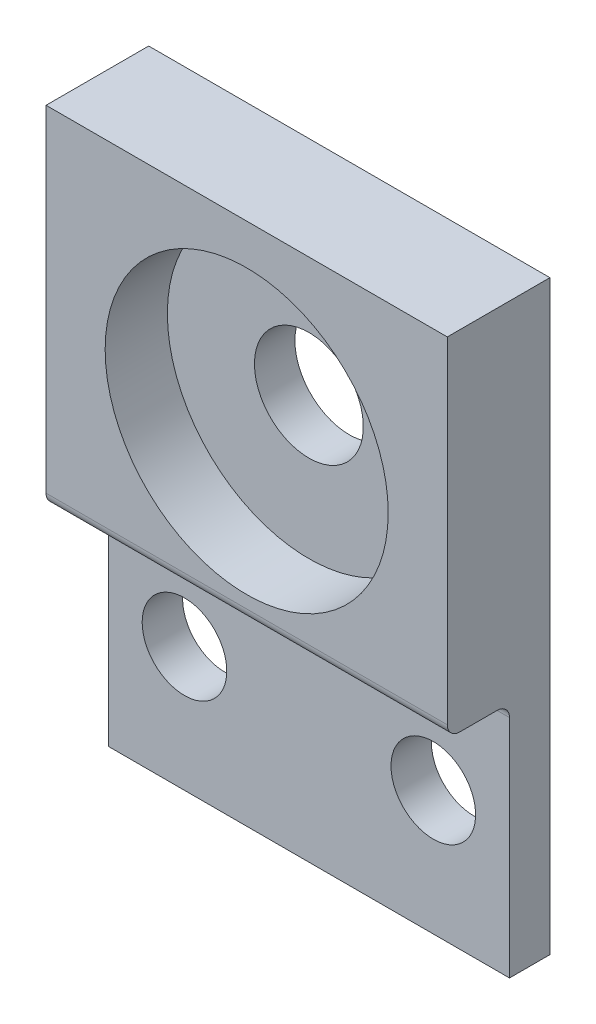
ISO-10303-21;
HEADER;
FILE_DESCRIPTION(('STEP AP214'),'2;1');
FILE_NAME('part.step','',(''),(''),'','','');
FILE_SCHEMA(('AUTOMOTIVE_DESIGN { 1 0 10303 214 1 1 1 1 }'));
ENDSEC;
DATA;
#1=APPLICATION_CONTEXT('core data for automotive mechanical design processes');
#2=APPLICATION_PROTOCOL_DEFINITION('international standard','automotive_design',2000,#1);
#3=PRODUCT_CONTEXT('',#1,'mechanical');
#4=PRODUCT('Part','Part','',(#3));
#5=PRODUCT_RELATED_PRODUCT_CATEGORY('part','',(#4));
#6=PRODUCT_DEFINITION_FORMATION('','',#4);
#7=PRODUCT_DEFINITION_CONTEXT('part definition',#1,'design');
#8=PRODUCT_DEFINITION('design','',#6,#7);
#9=PRODUCT_DEFINITION_SHAPE('','',#8);
#10=(LENGTH_UNIT() NAMED_UNIT(*) SI_UNIT(.MILLI.,.METRE.));
#11=(NAMED_UNIT(*) PLANE_ANGLE_UNIT() SI_UNIT($,.RADIAN.));
#12=(NAMED_UNIT(*) SI_UNIT($,.STERADIAN.) SOLID_ANGLE_UNIT());
#13=UNCERTAINTY_MEASURE_WITH_UNIT(LENGTH_MEASURE(1.E-05),#10,'distance_accuracy_value','');
#14=(GEOMETRIC_REPRESENTATION_CONTEXT(3) GLOBAL_UNCERTAINTY_ASSIGNED_CONTEXT((#13)) GLOBAL_UNIT_ASSIGNED_CONTEXT((#10,
#11,#12)) REPRESENTATION_CONTEXT('',''));
#15=CARTESIAN_POINT('',(0.,0.,0.));
#16=DIRECTION('',(0.,0.,1.));
#17=DIRECTION('',(1.,0.,0.));
#18=AXIS2_PLACEMENT_3D('',#15,#16,#17);
#19=CARTESIAN_POINT('',(0.,0.,3.25));
#20=DIRECTION('',(0.,0.,1.));
#21=DIRECTION('',(1.,0.,0.));
#22=AXIS2_PLACEMENT_3D('',#19,#20,#21);
#23=PLANE('',#22);
#24=CARTESIAN_POINT('',(26.125,10.,3.25));
#25=DIRECTION('',(0.,0.,1.));
#26=DIRECTION('',(1.,0.,0.));
#27=AXIS2_PLACEMENT_3D('',#24,#25,#26);
#28=CIRCLE('',#27,3.40036762718386);
#29=CARTESIAN_POINT('',(22.7246323728161,10.,3.25));
#30=VERTEX_POINT('',#29);
#31=EDGE_CURVE('E141',#30,#30,#28,.T.);
#32=ORIENTED_EDGE('',*,*,#31,.F.);
#33=EDGE_LOOP('',(#32));
#34=FACE_BOUND('',#33,.T.);
#35=CARTESIAN_POINT('',(6.125,10.,3.25));
#36=DIRECTION('',(0.,0.,1.));
#37=DIRECTION('',(1.,0.,0.));
#38=AXIS2_PLACEMENT_3D('',#35,#36,#37);
#39=CIRCLE('',#38,3.40036762718386);
#40=CARTESIAN_POINT('',(2.72463237281614,10.,3.25));
#41=VERTEX_POINT('',#40);
#42=EDGE_CURVE('E144',#41,#41,#39,.T.);
#43=ORIENTED_EDGE('',*,*,#42,.F.);
#44=EDGE_LOOP('',(#43));
#45=FACE_BOUND('',#44,.T.);
#46=DIRECTION('',(0.,1.,0.));
#47=VECTOR('',#46,1.);
#48=CARTESIAN_POINT('',(32.25,0.,3.25));
#49=LINE('',#48,#47);
#50=CARTESIAN_POINT('',(32.25,0.,3.25));
#51=VERTEX_POINT('',#50);
#52=CARTESIAN_POINT('',(32.25,18.125,3.25));
#53=VERTEX_POINT('',#52);
#54=EDGE_CURVE('E151',#51,#53,#49,.T.);
#55=ORIENTED_EDGE('',*,*,#54,.T.);
#56=DIRECTION('',(-1.,0.,0.));
#57=VECTOR('',#56,1.);
#58=CARTESIAN_POINT('',(0.,18.125,3.25));
#59=LINE('',#58,#57);
#60=CARTESIAN_POINT('',(0.,18.125,3.25));
#61=VERTEX_POINT('',#60);
#62=EDGE_CURVE('E187',#53,#61,#59,.T.);
#63=ORIENTED_EDGE('',*,*,#62,.T.);
#64=DIRECTION('',(0.,1.,0.));
#65=VECTOR('',#64,1.);
#66=CARTESIAN_POINT('',(0.,0.,3.25));
#67=LINE('',#66,#65);
#68=CARTESIAN_POINT('',(0.,0.,3.25));
#69=VERTEX_POINT('',#68);
#70=EDGE_CURVE('E154',#69,#61,#67,.T.);
#71=ORIENTED_EDGE('',*,*,#70,.F.);
#72=DIRECTION('',(1.,0.,0.));
#73=VECTOR('',#72,1.);
#74=CARTESIAN_POINT('',(0.,0.,3.25));
#75=LINE('',#74,#73);
#76=EDGE_CURVE('E148',#69,#51,#75,.T.);
#77=ORIENTED_EDGE('',*,*,#76,.T.);
#78=EDGE_LOOP('',(#55,#63,#71,#77));
#79=FACE_BOUND('',#78,.T.);
#80=ADVANCED_FACE('F37',(#34,#45,#79),#23,.T.);
#81=CARTESIAN_POINT('',(0.,0.,3.25));
#82=DIRECTION('',(0.,1.,0.));
#83=DIRECTION('',(-1.,0.,0.));
#84=AXIS2_PLACEMENT_3D('',#81,#82,#83);
#85=PLANE('',#84);
#86=DIRECTION('',(1.,0.,0.));
#87=VECTOR('',#86,1.);
#88=CARTESIAN_POINT('',(0.,0.,0.));
#89=LINE('',#88,#87);
#90=CARTESIAN_POINT('',(0.,0.,0.));
#91=VERTEX_POINT('',#90);
#92=CARTESIAN_POINT('',(32.25,0.,0.));
#93=VERTEX_POINT('',#92);
#94=EDGE_CURVE('E165',#91,#93,#89,.T.);
#95=ORIENTED_EDGE('',*,*,#94,.T.);
#96=DIRECTION('',(0.,0.,-1.));
#97=VECTOR('',#96,1.);
#98=CARTESIAN_POINT('',(32.25,0.,3.25));
#99=LINE('',#98,#97);
#100=EDGE_CURVE('E121',#51,#93,#99,.T.);
#101=ORIENTED_EDGE('',*,*,#100,.F.);
#102=ORIENTED_EDGE('',*,*,#76,.F.);
#103=DIRECTION('',(0.,0.,-1.));
#104=VECTOR('',#103,1.);
#105=CARTESIAN_POINT('',(0.,0.,3.25));
#106=LINE('',#105,#104);
#107=EDGE_CURVE('E159',#69,#91,#106,.T.);
#108=ORIENTED_EDGE('',*,*,#107,.T.);
#109=EDGE_LOOP('',(#95,#101,#102,#108));
#110=FACE_BOUND('',#109,.T.);
#111=ADVANCED_FACE('F197',(#110),#85,.F.);
#112=CARTESIAN_POINT('',(32.25,0.,3.25));
#113=DIRECTION('',(-1.,0.,0.));
#114=DIRECTION('',(0.,-1.,0.));
#115=AXIS2_PLACEMENT_3D('',#112,#113,#114);
#116=PLANE('',#115);
#117=DIRECTION('',(0.,1.,0.));
#118=VECTOR('',#117,1.);
#119=CARTESIAN_POINT('',(32.25,0.,8.25));
#120=LINE('',#119,#118);
#121=CARTESIAN_POINT('',(32.25,20.125,8.25));
#122=VERTEX_POINT('',#121);
#123=CARTESIAN_POINT('',(32.25,47.125,8.25));
#124=VERTEX_POINT('',#123);
#125=EDGE_CURVE('E102',#122,#124,#120,.T.);
#126=ORIENTED_EDGE('',*,*,#125,.F.);
#127=CARTESIAN_POINT('',(32.25,20.125,7.25));
#128=DIRECTION('',(-1.,0.,0.));
#129=DIRECTION('',(0.,-1.,0.));
#130=AXIS2_PLACEMENT_3D('',#127,#128,#129);
#131=CIRCLE('',#130,1.);
#132=CARTESIAN_POINT('',(32.25,19.125,7.25));
#133=VERTEX_POINT('',#132);
#134=EDGE_CURVE('E179',#122,#133,#131,.F.);
#135=ORIENTED_EDGE('',*,*,#134,.T.);
#136=DIRECTION('',(0.,0.,-1.));
#137=VECTOR('',#136,1.);
#138=CARTESIAN_POINT('',(32.25,19.125,8.25));
#139=LINE('',#138,#137);
#140=CARTESIAN_POINT('',(32.25,19.125,4.25));
#141=VERTEX_POINT('',#140);
#142=EDGE_CURVE('E134',#133,#141,#139,.T.);
#143=ORIENTED_EDGE('',*,*,#142,.T.);
#144=CARTESIAN_POINT('',(32.25,18.125,4.25));
#145=DIRECTION('',(-1.,0.,0.));
#146=DIRECTION('',(0.,-1.,0.));
#147=AXIS2_PLACEMENT_3D('',#144,#145,#146);
#148=CIRCLE('',#147,1.);
#149=EDGE_CURVE('E11',#141,#53,#148,.T.);
#150=ORIENTED_EDGE('',*,*,#149,.T.);
#151=ORIENTED_EDGE('',*,*,#54,.F.);
#152=ORIENTED_EDGE('',*,*,#100,.T.);
#153=DIRECTION('',(0.,1.,0.));
#154=VECTOR('',#153,1.);
#155=CARTESIAN_POINT('',(32.25,0.,0.));
#156=LINE('',#155,#154);
#157=CARTESIAN_POINT('',(32.25,47.125,0.));
#158=VERTEX_POINT('',#157);
#159=EDGE_CURVE('E117',#93,#158,#156,.T.);
#160=ORIENTED_EDGE('',*,*,#159,.T.);
#161=DIRECTION('',(0.,0.,-1.));
#162=VECTOR('',#161,1.);
#163=CARTESIAN_POINT('',(32.25,47.125,3.25));
#164=LINE('',#163,#162);
#165=EDGE_CURVE('E114',#124,#158,#164,.T.);
#166=ORIENTED_EDGE('',*,*,#165,.F.);
#167=EDGE_LOOP('',(#126,#135,#143,#150,#151,#152,#160,#166));
#168=FACE_BOUND('',#167,.T.);
#169=ADVANCED_FACE('F115',(#168),#116,.F.);
#170=CARTESIAN_POINT('',(0.,47.125,3.25));
#171=DIRECTION('',(0.,1.,0.));
#172=DIRECTION('',(0.,0.,1.));
#173=AXIS2_PLACEMENT_3D('',#170,#171,#172);
#174=PLANE('',#173);
#175=DIRECTION('',(1.,0.,0.));
#176=VECTOR('',#175,1.);
#177=CARTESIAN_POINT('',(0.,47.125,0.));
#178=LINE('',#177,#176);
#179=CARTESIAN_POINT('',(0.,47.125,0.));
#180=VERTEX_POINT('',#179);
#181=EDGE_CURVE('E169',#180,#158,#178,.T.);
#182=ORIENTED_EDGE('',*,*,#181,.F.);
#183=DIRECTION('',(0.,0.,-1.));
#184=VECTOR('',#183,1.);
#185=CARTESIAN_POINT('',(0.,47.125,3.25));
#186=LINE('',#185,#184);
#187=CARTESIAN_POINT('',(0.,47.125,8.25));
#188=VERTEX_POINT('',#187);
#189=EDGE_CURVE('E122',#188,#180,#186,.T.);
#190=ORIENTED_EDGE('',*,*,#189,.F.);
#191=DIRECTION('',(1.,0.,0.));
#192=VECTOR('',#191,1.);
#193=CARTESIAN_POINT('',(0.,47.125,8.25));
#194=LINE('',#193,#192);
#195=EDGE_CURVE('E107',#188,#124,#194,.T.);
#196=ORIENTED_EDGE('',*,*,#195,.T.);
#197=ORIENTED_EDGE('',*,*,#165,.T.);
#198=EDGE_LOOP('',(#182,#190,#196,#197));
#199=FACE_BOUND('',#198,.T.);
#200=ADVANCED_FACE('F125',(#199),#174,.T.);
#201=CARTESIAN_POINT('',(0.,0.,3.25));
#202=DIRECTION('',(-1.,0.,0.));
#203=DIRECTION('',(0.,0.,1.));
#204=AXIS2_PLACEMENT_3D('',#201,#202,#203);
#205=PLANE('',#204);
#206=DIRECTION('',(0.,0.,-1.));
#207=VECTOR('',#206,1.);
#208=CARTESIAN_POINT('',(0.,19.125,8.25));
#209=LINE('',#208,#207);
#210=CARTESIAN_POINT('',(0.,19.125,7.25));
#211=VERTEX_POINT('',#210);
#212=CARTESIAN_POINT('',(0.,19.125,4.25));
#213=VERTEX_POINT('',#212);
#214=EDGE_CURVE('E129',#211,#213,#209,.T.);
#215=ORIENTED_EDGE('',*,*,#214,.F.);
#216=CARTESIAN_POINT('',(0.,20.125,7.25));
#217=DIRECTION('',(-1.,0.,0.));
#218=DIRECTION('',(0.,0.,1.));
#219=AXIS2_PLACEMENT_3D('',#216,#217,#218);
#220=CIRCLE('',#219,1.);
#221=CARTESIAN_POINT('',(0.,20.125,8.25));
#222=VERTEX_POINT('',#221);
#223=EDGE_CURVE('E185',#211,#222,#220,.T.);
#224=ORIENTED_EDGE('',*,*,#223,.T.);
#225=DIRECTION('',(0.,1.,0.));
#226=VECTOR('',#225,1.);
#227=CARTESIAN_POINT('',(0.,0.,8.25));
#228=LINE('',#227,#226);
#229=EDGE_CURVE('E127',#222,#188,#228,.T.);
#230=ORIENTED_EDGE('',*,*,#229,.T.);
#231=ORIENTED_EDGE('',*,*,#189,.T.);
#232=DIRECTION('',(0.,1.,0.));
#233=VECTOR('',#232,1.);
#234=CARTESIAN_POINT('',(0.,0.,0.));
#235=LINE('',#234,#233);
#236=EDGE_CURVE('E171',#91,#180,#235,.T.);
#237=ORIENTED_EDGE('',*,*,#236,.F.);
#238=ORIENTED_EDGE('',*,*,#107,.F.);
#239=ORIENTED_EDGE('',*,*,#70,.T.);
#240=CARTESIAN_POINT('',(0.,18.125,4.25));
#241=DIRECTION('',(-1.,0.,0.));
#242=DIRECTION('',(0.,0.,1.));
#243=AXIS2_PLACEMENT_3D('',#240,#241,#242);
#244=CIRCLE('',#243,1.);
#245=EDGE_CURVE('E45',#61,#213,#244,.F.);
#246=ORIENTED_EDGE('',*,*,#245,.T.);
#247=EDGE_LOOP('',(#215,#224,#230,#231,#237,#238,#239,#246));
#248=FACE_BOUND('',#247,.T.);
#249=ADVANCED_FACE('F191',(#248),#205,.T.);
#250=CARTESIAN_POINT('',(6.125,10.,3.25));
#251=DIRECTION('',(0.,0.,-1.));
#252=DIRECTION('',(-1.,0.,0.));
#253=AXIS2_PLACEMENT_3D('',#250,#251,#252);
#254=CYLINDRICAL_SURFACE('',#253,3.40036762718386);
#255=CARTESIAN_POINT('',(6.125,10.,0.));
#256=DIRECTION('',(0.,0.,1.));
#257=DIRECTION('',(1.,0.,0.));
#258=AXIS2_PLACEMENT_3D('',#255,#256,#257);
#259=CIRCLE('',#258,3.40036762718386);
#260=CARTESIAN_POINT('',(2.72463237281614,10.,0.));
#261=VERTEX_POINT('',#260);
#262=EDGE_CURVE('E162',#261,#261,#259,.T.);
#263=CARTESIAN_POINT('',(2.72463237281614,10.,3.25));
#264=CARTESIAN_POINT('',(2.72463237281614,10.,3.21614583333333));
#265=CARTESIAN_POINT('',(2.72463237281614,10.,3.18229166666667));
#266=CARTESIAN_POINT('',(2.72463237281614,10.,3.11458333333333));
#267=CARTESIAN_POINT('',(2.72463237281614,10.,3.08072916666667));
#268=CARTESIAN_POINT('',(2.72463237281614,10.,3.01302083333333));
#269=CARTESIAN_POINT('',(2.72463237281614,10.,2.97916666666667));
#270=CARTESIAN_POINT('',(2.72463237281614,10.,2.91145833333333));
#271=CARTESIAN_POINT('',(2.72463237281614,10.,2.87760416666667));
#272=CARTESIAN_POINT('',(2.72463237281614,10.,2.80989583333333));
#273=CARTESIAN_POINT('',(2.72463237281614,10.,2.77604166666667));
#274=CARTESIAN_POINT('',(2.72463237281614,10.,2.70833333333333));
#275=CARTESIAN_POINT('',(2.72463237281614,10.,2.67447916666667));
#276=CARTESIAN_POINT('',(2.72463237281614,10.,2.60677083333333));
#277=CARTESIAN_POINT('',(2.72463237281614,10.,2.57291666666667));
#278=CARTESIAN_POINT('',(2.72463237281614,10.,2.50520833333333));
#279=CARTESIAN_POINT('',(2.72463237281614,10.,2.47135416666667));
#280=CARTESIAN_POINT('',(2.72463237281614,10.,2.40364583333333));
#281=CARTESIAN_POINT('',(2.72463237281614,10.,2.36979166666667));
#282=CARTESIAN_POINT('',(2.72463237281614,10.,2.30208333333333));
#283=CARTESIAN_POINT('',(2.72463237281614,10.,2.26822916666667));
#284=CARTESIAN_POINT('',(2.72463237281614,10.,2.20052083333333));
#285=CARTESIAN_POINT('',(2.72463237281614,10.,2.16666666666667));
#286=CARTESIAN_POINT('',(2.72463237281614,10.,2.09895833333333));
#287=CARTESIAN_POINT('',(2.72463237281614,10.,2.06510416666667));
#288=CARTESIAN_POINT('',(2.72463237281614,10.,1.99739583333333));
#289=CARTESIAN_POINT('',(2.72463237281614,10.,1.96354166666667));
#290=CARTESIAN_POINT('',(2.72463237281614,10.,1.89583333333333));
#291=CARTESIAN_POINT('',(2.72463237281614,10.,1.86197916666667));
#292=CARTESIAN_POINT('',(2.72463237281614,10.,1.79427083333333));
#293=CARTESIAN_POINT('',(2.72463237281614,10.,1.76041666666667));
#294=CARTESIAN_POINT('',(2.72463237281614,10.,1.69270833333333));
#295=CARTESIAN_POINT('',(2.72463237281614,10.,1.65885416666667));
#296=CARTESIAN_POINT('',(2.72463237281614,10.,1.59114583333333));
#297=CARTESIAN_POINT('',(2.72463237281614,10.,1.55729166666667));
#298=CARTESIAN_POINT('',(2.72463237281614,10.,1.48958333333333));
#299=CARTESIAN_POINT('',(2.72463237281614,10.,1.45572916666667));
#300=CARTESIAN_POINT('',(2.72463237281614,10.,1.38802083333333));
#301=CARTESIAN_POINT('',(2.72463237281614,10.,1.35416666666667));
#302=CARTESIAN_POINT('',(2.72463237281614,10.,1.28645833333333));
#303=CARTESIAN_POINT('',(2.72463237281614,10.,1.25260416666667));
#304=CARTESIAN_POINT('',(2.72463237281614,10.,1.18489583333333));
#305=CARTESIAN_POINT('',(2.72463237281614,10.,1.15104166666667));
#306=CARTESIAN_POINT('',(2.72463237281614,10.,1.08333333333333));
#307=CARTESIAN_POINT('',(2.72463237281614,10.,1.04947916666667));
#308=CARTESIAN_POINT('',(2.72463237281614,10.,0.981770833333333));
#309=CARTESIAN_POINT('',(2.72463237281614,10.,0.947916666666667));
#310=CARTESIAN_POINT('',(2.72463237281614,10.,0.880208333333333));
#311=CARTESIAN_POINT('',(2.72463237281614,10.,0.846354166666667));
#312=CARTESIAN_POINT('',(2.72463237281614,10.,0.778645833333333));
#313=CARTESIAN_POINT('',(2.72463237281614,10.,0.744791666666667));
#314=CARTESIAN_POINT('',(2.72463237281614,10.,0.677083333333333));
#315=CARTESIAN_POINT('',(2.72463237281614,10.,0.643229166666667));
#316=CARTESIAN_POINT('',(2.72463237281614,10.,0.575520833333333));
#317=CARTESIAN_POINT('',(2.72463237281614,10.,0.541666666666667));
#318=CARTESIAN_POINT('',(2.72463237281614,10.,0.473958333333333));
#319=CARTESIAN_POINT('',(2.72463237281614,10.,0.440104166666667));
#320=CARTESIAN_POINT('',(2.72463237281614,10.,0.372395833333333));
#321=CARTESIAN_POINT('',(2.72463237281614,10.,0.338541666666667));
#322=CARTESIAN_POINT('',(2.72463237281614,10.,0.270833333333333));
#323=CARTESIAN_POINT('',(2.72463237281614,10.,0.236979166666667));
#324=CARTESIAN_POINT('',(2.72463237281614,10.,0.169270833333333));
#325=CARTESIAN_POINT('',(2.72463237281614,10.,0.135416666666667));
#326=CARTESIAN_POINT('',(2.72463237281614,10.,0.0677083333333334));
#327=CARTESIAN_POINT('',(2.72463237281614,10.,0.0338541666666667));
#328=CARTESIAN_POINT('',(2.72463237281614,10.,0.));
#329=B_SPLINE_CURVE_WITH_KNOTS('',3,(#263,#264,#265,#266,#267,#268,#269,#270,#271,#272,#273,
#274,#275,#276,#277,#278,#279,#280,#281,#282,#283,#284,#285,#286,#287,#288,#289,#290,#291,#292,
#293,#294,#295,#296,#297,#298,#299,#300,#301,#302,#303,#304,#305,#306,#307,#308,#309,#310,#311,
#312,#313,#314,#315,#316,#317,#318,#319,#320,#321,#322,#323,#324,#325,#326,#327,#328),
.UNSPECIFIED.,.F.,.F.,(4,2,2,2,2,2,2,2,2,2,2,2,2,2,2,2,2,2,2,2,2,2,2,2,2,2,2,2,2,2,2,2,4),(0.,
0.1015625,0.203125,0.3046875,0.40625,0.5078125,0.609375,0.7109375,0.8125,0.9140625,1.015625,
1.1171875,1.21875,1.3203125,1.421875,1.5234375,1.625,1.7265625,1.828125,1.9296875,2.03125,
2.1328125,2.234375,2.3359375,2.4375,2.5390625,2.640625,2.7421875,2.84375,2.9453125,3.046875,
3.1484375,3.25),.UNSPECIFIED.);
#330=EDGE_CURVE('BSEAM249',#41,#261,#329,.T.);
#331=ORIENTED_EDGE('',*,*,#42,.T.);
#332=ORIENTED_EDGE('',*,*,#262,.F.);
#333=ORIENTED_EDGE('',*,*,#330,.T.);
#334=ORIENTED_EDGE('',*,*,#330,.F.);
#335=EDGE_LOOP('',(#331,#333,#332,#334));
#336=FACE_BOUND('',#335,.T.);
#337=ADVANCED_FACE('F249',(#336),#254,.F.);
#338=CARTESIAN_POINT('',(26.125,10.,3.25));
#339=DIRECTION('',(0.,0.,-1.));
#340=DIRECTION('',(-1.,0.,0.));
#341=AXIS2_PLACEMENT_3D('',#338,#339,#340);
#342=CYLINDRICAL_SURFACE('',#341,3.40036762718386);
#343=CARTESIAN_POINT('',(26.125,10.,0.));
#344=DIRECTION('',(0.,0.,1.));
#345=DIRECTION('',(1.,0.,0.));
#346=AXIS2_PLACEMENT_3D('',#343,#344,#345);
#347=CIRCLE('',#346,3.40036762718386);
#348=CARTESIAN_POINT('',(22.7246323728161,10.,0.));
#349=VERTEX_POINT('',#348);
#350=EDGE_CURVE('E137',#349,#349,#347,.T.);
#351=CARTESIAN_POINT('',(22.7246323728161,10.,3.25));
#352=CARTESIAN_POINT('',(22.7246323728161,10.,3.21614583333333));
#353=CARTESIAN_POINT('',(22.7246323728161,10.,3.18229166666667));
#354=CARTESIAN_POINT('',(22.7246323728161,10.,3.11458333333333));
#355=CARTESIAN_POINT('',(22.7246323728161,10.,3.08072916666667));
#356=CARTESIAN_POINT('',(22.7246323728161,10.,3.01302083333333));
#357=CARTESIAN_POINT('',(22.7246323728161,10.,2.97916666666667));
#358=CARTESIAN_POINT('',(22.7246323728161,10.,2.91145833333333));
#359=CARTESIAN_POINT('',(22.7246323728161,10.,2.87760416666667));
#360=CARTESIAN_POINT('',(22.7246323728161,10.,2.80989583333333));
#361=CARTESIAN_POINT('',(22.7246323728161,10.,2.77604166666667));
#362=CARTESIAN_POINT('',(22.7246323728161,10.,2.70833333333333));
#363=CARTESIAN_POINT('',(22.7246323728161,10.,2.67447916666667));
#364=CARTESIAN_POINT('',(22.7246323728161,10.,2.60677083333333));
#365=CARTESIAN_POINT('',(22.7246323728161,10.,2.57291666666667));
#366=CARTESIAN_POINT('',(22.7246323728161,10.,2.50520833333333));
#367=CARTESIAN_POINT('',(22.7246323728161,10.,2.47135416666667));
#368=CARTESIAN_POINT('',(22.7246323728161,10.,2.40364583333333));
#369=CARTESIAN_POINT('',(22.7246323728161,10.,2.36979166666667));
#370=CARTESIAN_POINT('',(22.7246323728161,10.,2.30208333333333));
#371=CARTESIAN_POINT('',(22.7246323728161,10.,2.26822916666667));
#372=CARTESIAN_POINT('',(22.7246323728161,10.,2.20052083333333));
#373=CARTESIAN_POINT('',(22.7246323728161,10.,2.16666666666667));
#374=CARTESIAN_POINT('',(22.7246323728161,10.,2.09895833333333));
#375=CARTESIAN_POINT('',(22.7246323728161,10.,2.06510416666667));
#376=CARTESIAN_POINT('',(22.7246323728161,10.,1.99739583333333));
#377=CARTESIAN_POINT('',(22.7246323728161,10.,1.96354166666667));
#378=CARTESIAN_POINT('',(22.7246323728161,10.,1.89583333333333));
#379=CARTESIAN_POINT('',(22.7246323728161,10.,1.86197916666667));
#380=CARTESIAN_POINT('',(22.7246323728161,10.,1.79427083333333));
#381=CARTESIAN_POINT('',(22.7246323728161,10.,1.76041666666667));
#382=CARTESIAN_POINT('',(22.7246323728161,10.,1.69270833333333));
#383=CARTESIAN_POINT('',(22.7246323728161,10.,1.65885416666667));
#384=CARTESIAN_POINT('',(22.7246323728161,10.,1.59114583333333));
#385=CARTESIAN_POINT('',(22.7246323728161,10.,1.55729166666667));
#386=CARTESIAN_POINT('',(22.7246323728161,10.,1.48958333333333));
#387=CARTESIAN_POINT('',(22.7246323728161,10.,1.45572916666667));
#388=CARTESIAN_POINT('',(22.7246323728161,10.,1.38802083333333));
#389=CARTESIAN_POINT('',(22.7246323728161,10.,1.35416666666667));
#390=CARTESIAN_POINT('',(22.7246323728161,10.,1.28645833333333));
#391=CARTESIAN_POINT('',(22.7246323728161,10.,1.25260416666667));
#392=CARTESIAN_POINT('',(22.7246323728161,10.,1.18489583333333));
#393=CARTESIAN_POINT('',(22.7246323728161,10.,1.15104166666667));
#394=CARTESIAN_POINT('',(22.7246323728161,10.,1.08333333333333));
#395=CARTESIAN_POINT('',(22.7246323728161,10.,1.04947916666667));
#396=CARTESIAN_POINT('',(22.7246323728161,10.,0.981770833333333));
#397=CARTESIAN_POINT('',(22.7246323728161,10.,0.947916666666667));
#398=CARTESIAN_POINT('',(22.7246323728161,10.,0.880208333333333));
#399=CARTESIAN_POINT('',(22.7246323728161,10.,0.846354166666667));
#400=CARTESIAN_POINT('',(22.7246323728161,10.,0.778645833333333));
#401=CARTESIAN_POINT('',(22.7246323728161,10.,0.744791666666667));
#402=CARTESIAN_POINT('',(22.7246323728161,10.,0.677083333333333));
#403=CARTESIAN_POINT('',(22.7246323728161,10.,0.643229166666667));
#404=CARTESIAN_POINT('',(22.7246323728161,10.,0.575520833333333));
#405=CARTESIAN_POINT('',(22.7246323728161,10.,0.541666666666667));
#406=CARTESIAN_POINT('',(22.7246323728161,10.,0.473958333333333));
#407=CARTESIAN_POINT('',(22.7246323728161,10.,0.440104166666667));
#408=CARTESIAN_POINT('',(22.7246323728161,10.,0.372395833333333));
#409=CARTESIAN_POINT('',(22.7246323728161,10.,0.338541666666667));
#410=CARTESIAN_POINT('',(22.7246323728161,10.,0.270833333333333));
#411=CARTESIAN_POINT('',(22.7246323728161,10.,0.236979166666667));
#412=CARTESIAN_POINT('',(22.7246323728161,10.,0.169270833333333));
#413=CARTESIAN_POINT('',(22.7246323728161,10.,0.135416666666667));
#414=CARTESIAN_POINT('',(22.7246323728161,10.,0.0677083333333334));
#415=CARTESIAN_POINT('',(22.7246323728161,10.,0.0338541666666667));
#416=CARTESIAN_POINT('',(22.7246323728161,10.,0.));
#417=B_SPLINE_CURVE_WITH_KNOTS('',3,(#351,#352,#353,#354,#355,#356,#357,#358,#359,#360,#361,
#362,#363,#364,#365,#366,#367,#368,#369,#370,#371,#372,#373,#374,#375,#376,#377,#378,#379,#380,
#381,#382,#383,#384,#385,#386,#387,#388,#389,#390,#391,#392,#393,#394,#395,#396,#397,#398,#399,
#400,#401,#402,#403,#404,#405,#406,#407,#408,#409,#410,#411,#412,#413,#414,#415,#416),
.UNSPECIFIED.,.F.,.F.,(4,2,2,2,2,2,2,2,2,2,2,2,2,2,2,2,2,2,2,2,2,2,2,2,2,2,2,2,2,2,2,2,4),(0.,
0.1015625,0.203125,0.3046875,0.40625,0.5078125,0.609375,0.7109375,0.8125,0.9140625,1.015625,
1.1171875,1.21875,1.3203125,1.421875,1.5234375,1.625,1.7265625,1.828125,1.9296875,2.03125,
2.1328125,2.234375,2.3359375,2.4375,2.5390625,2.640625,2.7421875,2.84375,2.9453125,3.046875,
3.1484375,3.25),.UNSPECIFIED.);
#418=EDGE_CURVE('BSEAM235',#30,#349,#417,.T.);
#419=ORIENTED_EDGE('',*,*,#31,.T.);
#420=ORIENTED_EDGE('',*,*,#350,.F.);
#421=ORIENTED_EDGE('',*,*,#418,.T.);
#422=ORIENTED_EDGE('',*,*,#418,.F.);
#423=EDGE_LOOP('',(#419,#421,#420,#422));
#424=FACE_BOUND('',#423,.T.);
#425=ADVANCED_FACE('F235',(#424),#342,.F.);
#426=CARTESIAN_POINT('',(16.125,32.5,3.25));
#427=DIRECTION('',(0.,0.,-1.));
#428=DIRECTION('',(-1.,0.,0.));
#429=AXIS2_PLACEMENT_3D('',#426,#427,#428);
#430=CYLINDRICAL_SURFACE('',#429,4.375);
#431=CARTESIAN_POINT('',(16.125,32.5,3.25));
#432=DIRECTION('',(0.,0.,1.));
#433=DIRECTION('',(1.,0.,0.));
#434=AXIS2_PLACEMENT_3D('',#431,#432,#433);
#435=CIRCLE('',#434,4.375);
#436=CARTESIAN_POINT('',(11.75,32.5,3.25));
#437=VERTEX_POINT('',#436);
#438=EDGE_CURVE('E156',#437,#437,#435,.T.);
#439=CARTESIAN_POINT('',(16.125,32.5,0.));
#440=DIRECTION('',(0.,0.,1.));
#441=DIRECTION('',(1.,0.,0.));
#442=AXIS2_PLACEMENT_3D('',#439,#440,#441);
#443=CIRCLE('',#442,4.375);
#444=CARTESIAN_POINT('',(11.75,32.5,0.));
#445=VERTEX_POINT('',#444);
#446=EDGE_CURVE('E145',#445,#445,#443,.T.);
#447=CARTESIAN_POINT('',(11.75,32.5,3.25));
#448=CARTESIAN_POINT('',(11.75,32.5,3.21614583333333));
#449=CARTESIAN_POINT('',(11.75,32.5,3.18229166666667));
#450=CARTESIAN_POINT('',(11.75,32.5,3.11458333333333));
#451=CARTESIAN_POINT('',(11.75,32.5,3.08072916666667));
#452=CARTESIAN_POINT('',(11.75,32.5,3.01302083333333));
#453=CARTESIAN_POINT('',(11.75,32.5,2.97916666666667));
#454=CARTESIAN_POINT('',(11.75,32.5,2.91145833333333));
#455=CARTESIAN_POINT('',(11.75,32.5,2.87760416666667));
#456=CARTESIAN_POINT('',(11.75,32.5,2.80989583333333));
#457=CARTESIAN_POINT('',(11.75,32.5,2.77604166666667));
#458=CARTESIAN_POINT('',(11.75,32.5,2.70833333333333));
#459=CARTESIAN_POINT('',(11.75,32.5,2.67447916666667));
#460=CARTESIAN_POINT('',(11.75,32.5,2.60677083333333));
#461=CARTESIAN_POINT('',(11.75,32.5,2.57291666666667));
#462=CARTESIAN_POINT('',(11.75,32.5,2.50520833333333));
#463=CARTESIAN_POINT('',(11.75,32.5,2.47135416666667));
#464=CARTESIAN_POINT('',(11.75,32.5,2.40364583333333));
#465=CARTESIAN_POINT('',(11.75,32.5,2.36979166666667));
#466=CARTESIAN_POINT('',(11.75,32.5,2.30208333333333));
#467=CARTESIAN_POINT('',(11.75,32.5,2.26822916666667));
#468=CARTESIAN_POINT('',(11.75,32.5,2.20052083333333));
#469=CARTESIAN_POINT('',(11.75,32.5,2.16666666666667));
#470=CARTESIAN_POINT('',(11.75,32.5,2.09895833333333));
#471=CARTESIAN_POINT('',(11.75,32.5,2.06510416666667));
#472=CARTESIAN_POINT('',(11.75,32.5,1.99739583333333));
#473=CARTESIAN_POINT('',(11.75,32.5,1.96354166666667));
#474=CARTESIAN_POINT('',(11.75,32.5,1.89583333333333));
#475=CARTESIAN_POINT('',(11.75,32.5,1.86197916666667));
#476=CARTESIAN_POINT('',(11.75,32.5,1.79427083333333));
#477=CARTESIAN_POINT('',(11.75,32.5,1.76041666666667));
#478=CARTESIAN_POINT('',(11.75,32.5,1.69270833333333));
#479=CARTESIAN_POINT('',(11.75,32.5,1.65885416666667));
#480=CARTESIAN_POINT('',(11.75,32.5,1.59114583333333));
#481=CARTESIAN_POINT('',(11.75,32.5,1.55729166666667));
#482=CARTESIAN_POINT('',(11.75,32.5,1.48958333333333));
#483=CARTESIAN_POINT('',(11.75,32.5,1.45572916666667));
#484=CARTESIAN_POINT('',(11.75,32.5,1.38802083333333));
#485=CARTESIAN_POINT('',(11.75,32.5,1.35416666666667));
#486=CARTESIAN_POINT('',(11.75,32.5,1.28645833333333));
#487=CARTESIAN_POINT('',(11.75,32.5,1.25260416666667));
#488=CARTESIAN_POINT('',(11.75,32.5,1.18489583333333));
#489=CARTESIAN_POINT('',(11.75,32.5,1.15104166666667));
#490=CARTESIAN_POINT('',(11.75,32.5,1.08333333333333));
#491=CARTESIAN_POINT('',(11.75,32.5,1.04947916666667));
#492=CARTESIAN_POINT('',(11.75,32.5,0.981770833333333));
#493=CARTESIAN_POINT('',(11.75,32.5,0.947916666666667));
#494=CARTESIAN_POINT('',(11.75,32.5,0.880208333333333));
#495=CARTESIAN_POINT('',(11.75,32.5,0.846354166666667));
#496=CARTESIAN_POINT('',(11.75,32.5,0.778645833333333));
#497=CARTESIAN_POINT('',(11.75,32.5,0.744791666666667));
#498=CARTESIAN_POINT('',(11.75,32.5,0.677083333333333));
#499=CARTESIAN_POINT('',(11.75,32.5,0.643229166666667));
#500=CARTESIAN_POINT('',(11.75,32.5,0.575520833333333));
#501=CARTESIAN_POINT('',(11.75,32.5,0.541666666666667));
#502=CARTESIAN_POINT('',(11.75,32.5,0.473958333333333));
#503=CARTESIAN_POINT('',(11.75,32.5,0.440104166666667));
#504=CARTESIAN_POINT('',(11.75,32.5,0.372395833333333));
#505=CARTESIAN_POINT('',(11.75,32.5,0.338541666666667));
#506=CARTESIAN_POINT('',(11.75,32.5,0.270833333333333));
#507=CARTESIAN_POINT('',(11.75,32.5,0.236979166666667));
#508=CARTESIAN_POINT('',(11.75,32.5,0.169270833333333));
#509=CARTESIAN_POINT('',(11.75,32.5,0.135416666666667));
#510=CARTESIAN_POINT('',(11.75,32.5,0.0677083333333334));
#511=CARTESIAN_POINT('',(11.75,32.5,0.0338541666666667));
#512=CARTESIAN_POINT('',(11.75,32.5,0.));
#513=B_SPLINE_CURVE_WITH_KNOTS('',3,(#447,#448,#449,#450,#451,#452,#453,#454,#455,#456,#457,
#458,#459,#460,#461,#462,#463,#464,#465,#466,#467,#468,#469,#470,#471,#472,#473,#474,#475,#476,
#477,#478,#479,#480,#481,#482,#483,#484,#485,#486,#487,#488,#489,#490,#491,#492,#493,#494,#495,
#496,#497,#498,#499,#500,#501,#502,#503,#504,#505,#506,#507,#508,#509,#510,#511,#512),
.UNSPECIFIED.,.F.,.F.,(4,2,2,2,2,2,2,2,2,2,2,2,2,2,2,2,2,2,2,2,2,2,2,2,2,2,2,2,2,2,2,2,4),(0.,
0.1015625,0.203125,0.3046875,0.40625,0.5078125,0.609375,0.7109375,0.8125,0.9140625,1.015625,
1.1171875,1.21875,1.3203125,1.421875,1.5234375,1.625,1.7265625,1.828125,1.9296875,2.03125,
2.1328125,2.234375,2.3359375,2.4375,2.5390625,2.640625,2.7421875,2.84375,2.9453125,3.046875,
3.1484375,3.25),.UNSPECIFIED.);
#514=EDGE_CURVE('BSEAM228',#437,#445,#513,.T.);
#515=ORIENTED_EDGE('',*,*,#438,.T.);
#516=ORIENTED_EDGE('',*,*,#446,.F.);
#517=ORIENTED_EDGE('',*,*,#514,.T.);
#518=ORIENTED_EDGE('',*,*,#514,.F.);
#519=EDGE_LOOP('',(#515,#517,#516,#518));
#520=FACE_BOUND('',#519,.T.);
#521=ADVANCED_FACE('F228',(#520),#430,.F.);
#522=CARTESIAN_POINT('',(16.125,32.5,3.25));
#523=DIRECTION('',(0.,0.,1.));
#524=DIRECTION('',(1.,0.,0.));
#525=AXIS2_PLACEMENT_3D('',#522,#523,#524);
#526=CIRCLE('',#525,11.375);
#527=CARTESIAN_POINT('',(27.5,32.5,3.25));
#528=VERTEX_POINT('',#527);
#529=EDGE_CURVE('E138',#528,#528,#526,.F.);
#530=ORIENTED_EDGE('',*,*,#529,.F.);
#531=EDGE_LOOP('',(#530));
#532=FACE_BOUND('',#531,.T.);
#533=ORIENTED_EDGE('',*,*,#438,.F.);
#534=EDGE_LOOP('',(#533));
#535=FACE_BOUND('',#534,.T.);
#536=ADVANCED_FACE('F217',(#532,#535),#23,.T.);
#537=CARTESIAN_POINT('',(0.,0.,0.));
#538=DIRECTION('',(0.,0.,1.));
#539=DIRECTION('',(1.,0.,0.));
#540=AXIS2_PLACEMENT_3D('',#537,#538,#539);
#541=PLANE('',#540);
#542=ORIENTED_EDGE('',*,*,#446,.T.);
#543=EDGE_LOOP('',(#542));
#544=FACE_BOUND('',#543,.T.);
#545=ORIENTED_EDGE('',*,*,#181,.T.);
#546=ORIENTED_EDGE('',*,*,#159,.F.);
#547=ORIENTED_EDGE('',*,*,#94,.F.);
#548=ORIENTED_EDGE('',*,*,#236,.T.);
#549=EDGE_LOOP('',(#545,#546,#547,#548));
#550=FACE_BOUND('',#549,.T.);
#551=ORIENTED_EDGE('',*,*,#350,.T.);
#552=EDGE_LOOP('',(#551));
#553=FACE_BOUND('',#552,.T.);
#554=ORIENTED_EDGE('',*,*,#262,.T.);
#555=EDGE_LOOP('',(#554));
#556=FACE_BOUND('',#555,.T.);
#557=ADVANCED_FACE('F227',(#544,#550,#553,#556),#541,.F.);
#558=CARTESIAN_POINT('',(0.,19.125,8.25));
#559=DIRECTION('',(0.,1.,0.));
#560=DIRECTION('',(0.,0.,1.));
#561=AXIS2_PLACEMENT_3D('',#558,#559,#560);
#562=PLANE('',#561);
#563=ORIENTED_EDGE('',*,*,#142,.F.);
#564=DIRECTION('',(1.,0.,0.));
#565=VECTOR('',#564,1.);
#566=CARTESIAN_POINT('',(0.,19.125,7.25));
#567=LINE('',#566,#565);
#568=EDGE_CURVE('E183',#133,#211,#567,.F.);
#569=ORIENTED_EDGE('',*,*,#568,.T.);
#570=ORIENTED_EDGE('',*,*,#214,.T.);
#571=DIRECTION('',(-1.,0.,0.));
#572=VECTOR('',#571,1.);
#573=CARTESIAN_POINT('',(0.,19.125,4.25));
#574=LINE('',#573,#572);
#575=EDGE_CURVE('E181',#213,#141,#574,.F.);
#576=ORIENTED_EDGE('',*,*,#575,.T.);
#577=EDGE_LOOP('',(#563,#569,#570,#576));
#578=FACE_BOUND('',#577,.T.);
#579=ADVANCED_FACE('F200',(#578),#562,.F.);
#580=CARTESIAN_POINT('',(16.125,32.5,8.25));
#581=DIRECTION('',(0.,0.,-1.));
#582=DIRECTION('',(-1.,0.,0.));
#583=AXIS2_PLACEMENT_3D('',#580,#581,#582);
#584=CYLINDRICAL_SURFACE('',#583,11.375);
#585=ORIENTED_EDGE('',*,*,#529,.T.);
#586=EDGE_LOOP('',(#585));
#587=FACE_BOUND('',#586,.T.);
#588=CARTESIAN_POINT('',(16.125,32.5,8.25));
#589=DIRECTION('',(0.,0.,1.));
#590=DIRECTION('',(1.,0.,0.));
#591=AXIS2_PLACEMENT_3D('',#588,#589,#590);
#592=CIRCLE('',#591,11.375);
#593=CARTESIAN_POINT('',(27.5,32.5,8.25));
#594=VERTEX_POINT('',#593);
#595=EDGE_CURVE('E111',#594,#594,#592,.T.);
#596=ORIENTED_EDGE('',*,*,#595,.T.);
#597=EDGE_LOOP('',(#596));
#598=FACE_BOUND('',#597,.T.);
#599=ADVANCED_FACE('F210',(#587,#598),#584,.F.);
#600=CARTESIAN_POINT('',(0.,0.,8.25));
#601=DIRECTION('',(0.,0.,1.));
#602=DIRECTION('',(1.,0.,0.));
#603=AXIS2_PLACEMENT_3D('',#600,#601,#602);
#604=PLANE('',#603);
#605=ORIENTED_EDGE('',*,*,#595,.F.);
#606=EDGE_LOOP('',(#605));
#607=FACE_BOUND('',#606,.T.);
#608=ORIENTED_EDGE('',*,*,#229,.F.);
#609=DIRECTION('',(1.,0.,0.));
#610=VECTOR('',#609,1.);
#611=CARTESIAN_POINT('',(32.25,20.125,8.25));
#612=LINE('',#611,#610);
#613=EDGE_CURVE('E109',#222,#122,#612,.T.);
#614=ORIENTED_EDGE('',*,*,#613,.T.);
#615=ORIENTED_EDGE('',*,*,#125,.T.);
#616=ORIENTED_EDGE('',*,*,#195,.F.);
#617=EDGE_LOOP('',(#608,#614,#615,#616));
#618=FACE_BOUND('',#617,.T.);
#619=ADVANCED_FACE('F105',(#607,#618),#604,.T.);
#620=CARTESIAN_POINT('',(0.,20.125,7.25));
#621=DIRECTION('',(-1.,0.,0.));
#622=DIRECTION('',(0.,0.,1.));
#623=AXIS2_PLACEMENT_3D('',#620,#621,#622);
#624=CYLINDRICAL_SURFACE('',#623,1.);
#625=ORIENTED_EDGE('',*,*,#223,.F.);
#626=ORIENTED_EDGE('',*,*,#568,.F.);
#627=ORIENTED_EDGE('',*,*,#134,.F.);
#628=ORIENTED_EDGE('',*,*,#613,.F.);
#629=EDGE_LOOP('',(#625,#626,#627,#628));
#630=FACE_BOUND('',#629,.T.);
#631=ADVANCED_FACE('F204',(#630),#624,.T.);
#632=CARTESIAN_POINT('',(0.,18.125,4.25));
#633=DIRECTION('',(-1.,0.,0.));
#634=DIRECTION('',(0.,0.,1.));
#635=AXIS2_PLACEMENT_3D('',#632,#633,#634);
#636=CYLINDRICAL_SURFACE('',#635,1.);
#637=ORIENTED_EDGE('',*,*,#149,.F.);
#638=ORIENTED_EDGE('',*,*,#575,.F.);
#639=ORIENTED_EDGE('',*,*,#245,.F.);
#640=ORIENTED_EDGE('',*,*,#62,.F.);
#641=EDGE_LOOP('',(#637,#638,#639,#640));
#642=FACE_BOUND('',#641,.T.);
#643=ADVANCED_FACE('F39',(#642),#636,.F.);
#644=CLOSED_SHELL('',(#80,#111,#169,#200,#249,#337,#425,#521,#536,#557,#579,#599,#619,#631,#643));
#645=MANIFOLD_SOLID_BREP('B2',#644);
#646=ADVANCED_BREP_SHAPE_REPRESENTATION('',(#18,#645),#14);
#647=SHAPE_DEFINITION_REPRESENTATION(#9,#646);
ENDSEC;
END-ISO-10303-21;
